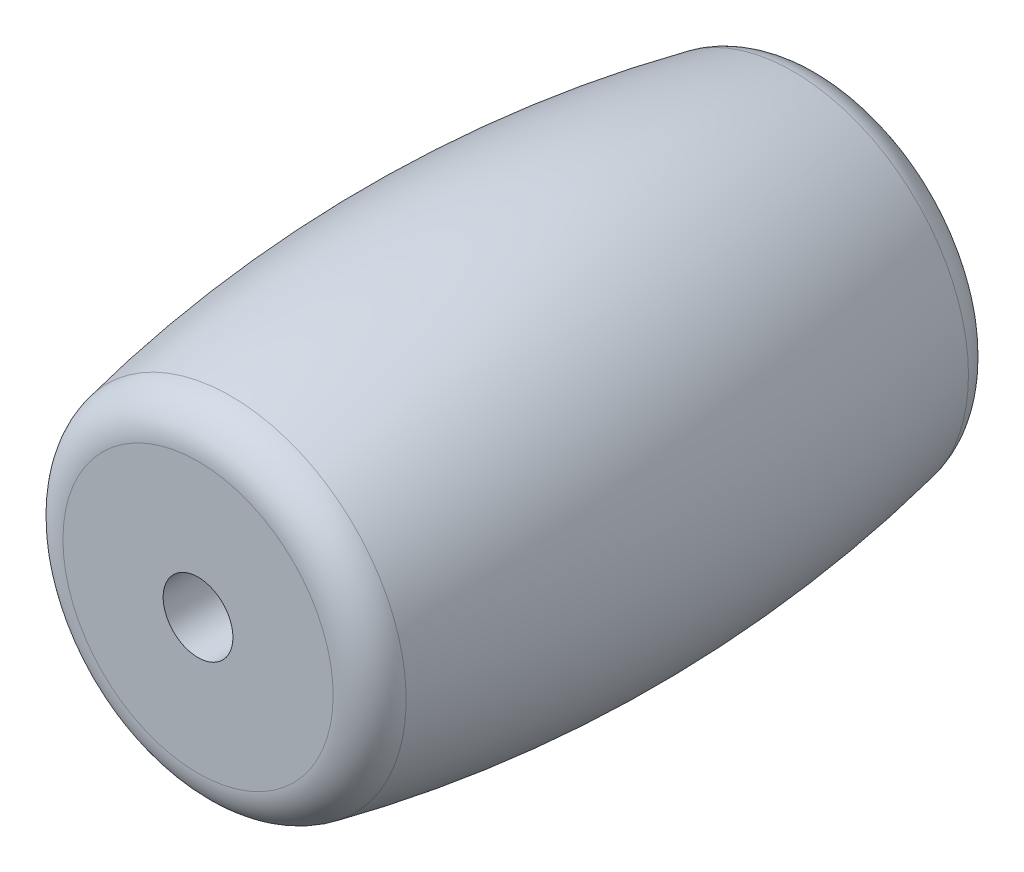
ISO-10303-21;
HEADER;
FILE_DESCRIPTION(('STEP AP214'),'2;1');
FILE_NAME('part.step','',(''),(''),'','','');
FILE_SCHEMA(('AUTOMOTIVE_DESIGN { 1 0 10303 214 1 1 1 1 }'));
ENDSEC;
DATA;
#1=APPLICATION_CONTEXT('core data for automotive mechanical design processes');
#2=APPLICATION_PROTOCOL_DEFINITION('international standard','automotive_design',2000,#1);
#3=PRODUCT_CONTEXT('',#1,'mechanical');
#4=PRODUCT('Part','Part','',(#3));
#5=PRODUCT_RELATED_PRODUCT_CATEGORY('part','',(#4));
#6=PRODUCT_DEFINITION_FORMATION('','',#4);
#7=PRODUCT_DEFINITION_CONTEXT('part definition',#1,'design');
#8=PRODUCT_DEFINITION('design','',#6,#7);
#9=PRODUCT_DEFINITION_SHAPE('','',#8);
#10=(LENGTH_UNIT() NAMED_UNIT(*) SI_UNIT(.MILLI.,.METRE.));
#11=(NAMED_UNIT(*) PLANE_ANGLE_UNIT() SI_UNIT($,.RADIAN.));
#12=(NAMED_UNIT(*) SI_UNIT($,.STERADIAN.) SOLID_ANGLE_UNIT());
#13=UNCERTAINTY_MEASURE_WITH_UNIT(LENGTH_MEASURE(1.E-05),#10,'distance_accuracy_value','');
#14=(GEOMETRIC_REPRESENTATION_CONTEXT(3) GLOBAL_UNCERTAINTY_ASSIGNED_CONTEXT((#13)) GLOBAL_UNIT_ASSIGNED_CONTEXT((#10,
#11,#12)) REPRESENTATION_CONTEXT('',''));
#15=CARTESIAN_POINT('',(0.,0.,0.));
#16=DIRECTION('',(0.,0.,1.));
#17=DIRECTION('',(1.,0.,0.));
#18=AXIS2_PLACEMENT_3D('',#15,#16,#17);
#19=CARTESIAN_POINT('',(0.,3.01016759554405,15.3));
#20=DIRECTION('',(0.,0.,-1.));
#21=DIRECTION('',(-1.,0.,0.));
#22=AXIS2_PLACEMENT_3D('',#19,#20,#21);
#23=PLANE('',#22);
#24=CARTESIAN_POINT('',(0.,1.31016759554405,15.3));
#25=DIRECTION('',(0.,0.,-1.));
#26=DIRECTION('',(-1.,0.,0.));
#27=AXIS2_PLACEMENT_3D('',#24,#25,#26);
#28=CIRCLE('',#27,6.58397541508283);
#29=CARTESIAN_POINT('',(-6.58397541508283,1.31016759554405,15.3));
#30=VERTEX_POINT('',#29);
#31=EDGE_CURVE('E10',#30,#30,#28,.F.);
#32=ORIENTED_EDGE('',*,*,#31,.T.);
#33=EDGE_LOOP('',(#32));
#34=FACE_BOUND('',#33,.T.);
#35=CARTESIAN_POINT('',(0.,1.31016759554405,15.3));
#36=DIRECTION('',(0.,0.,1.));
#37=DIRECTION('',(1.,0.,0.));
#38=AXIS2_PLACEMENT_3D('',#35,#36,#37);
#39=CIRCLE('',#38,1.7);
#40=CARTESIAN_POINT('',(1.7,1.31016759554405,15.3));
#41=VERTEX_POINT('',#40);
#42=EDGE_CURVE('E61',#41,#41,#39,.T.);
#43=ORIENTED_EDGE('',*,*,#42,.F.);
#44=EDGE_LOOP('',(#43));
#45=FACE_BOUND('',#44,.T.);
#46=ADVANCED_FACE('F37',(#34,#45),#23,.F.);
#47=CARTESIAN_POINT('',(0.,1.31016759554405,18.851269556302));
#48=DIRECTION('',(0.,0.,1.));
#49=DIRECTION('',(1.,0.,0.));
#50=AXIS2_PLACEMENT_3D('',#47,#48,#49);
#51=CYLINDRICAL_SURFACE('',#50,1.7);
#52=CARTESIAN_POINT('',(0.,1.31016759554405,-15.3));
#53=DIRECTION('',(0.,0.,1.));
#54=DIRECTION('',(1.,0.,0.));
#55=AXIS2_PLACEMENT_3D('',#52,#53,#54);
#56=CIRCLE('',#55,1.7);
#57=CARTESIAN_POINT('',(1.7,1.31016759554405,-15.3));
#58=VERTEX_POINT('',#57);
#59=EDGE_CURVE('E65',#58,#58,#56,.T.);
#60=ORIENTED_EDGE('',*,*,#59,.F.);
#61=EDGE_LOOP('',(#60));
#62=FACE_BOUND('',#61,.T.);
#63=ORIENTED_EDGE('',*,*,#42,.T.);
#64=EDGE_LOOP('',(#63));
#65=FACE_BOUND('',#64,.T.);
#66=ADVANCED_FACE('F72',(#62,#65),#51,.F.);
#67=CARTESIAN_POINT('',(0.,3.01016759554405,-15.3));
#68=DIRECTION('',(0.,0.,1.));
#69=DIRECTION('',(1.,0.,0.));
#70=AXIS2_PLACEMENT_3D('',#67,#68,#69);
#71=PLANE('',#70);
#72=CARTESIAN_POINT('',(0.,1.31016759554405,-15.3));
#73=DIRECTION('',(0.,0.,1.));
#74=DIRECTION('',(1.,0.,0.));
#75=AXIS2_PLACEMENT_3D('',#72,#73,#74);
#76=CIRCLE('',#75,6.58397541508283);
#77=CARTESIAN_POINT('',(6.58397541508283,1.31016759554405,-15.3));
#78=VERTEX_POINT('',#77);
#79=EDGE_CURVE('E45',#78,#78,#76,.F.);
#80=ORIENTED_EDGE('',*,*,#79,.T.);
#81=EDGE_LOOP('',(#80));
#82=FACE_BOUND('',#81,.T.);
#83=ORIENTED_EDGE('',*,*,#59,.T.);
#84=EDGE_LOOP('',(#83));
#85=FACE_BOUND('',#84,.T.);
#86=ADVANCED_FACE('F70',(#82,#85),#71,.F.);
#87=CARTESIAN_POINT('',(0.,1.31016759554405,0.));
#88=DIRECTION('',(0.,0.,1.));
#89=DIRECTION('',(1.,0.,0.));
#90=AXIS2_PLACEMENT_3D('',#87,#88,#89);
#91=DEGENERATE_TOROIDAL_SURFACE('',#90,58.0101675955441,67.9491721803793,.F.);
#92=CARTESIAN_POINT('',(0.,1.31016759554405,-13.7033409233287));
#93=DIRECTION('',(0.,0.,1.));
#94=DIRECTION('',(1.,0.,0.));
#95=AXIS2_PLACEMENT_3D('',#92,#93,#94);
#96=CIRCLE('',#95,8.5428822785065);
#97=CARTESIAN_POINT('',(8.5428822785065,1.31016759554405,-13.7033409233287));
#98=VERTEX_POINT('',#97);
#99=EDGE_CURVE('E50',#98,#98,#96,.T.);
#100=ORIENTED_EDGE('',*,*,#99,.T.);
#101=EDGE_LOOP('',(#100));
#102=FACE_BOUND('',#101,.T.);
#103=CARTESIAN_POINT('',(0.,1.31016759554405,13.7033409233287));
#104=DIRECTION('',(0.,0.,-1.));
#105=DIRECTION('',(-1.,0.,0.));
#106=AXIS2_PLACEMENT_3D('',#103,#104,#105);
#107=CIRCLE('',#106,8.5428822785065);
#108=CARTESIAN_POINT('',(-8.5428822785065,1.31016759554405,13.7033409233287));
#109=VERTEX_POINT('',#108);
#110=EDGE_CURVE('E55',#109,#109,#107,.T.);
#111=ORIENTED_EDGE('',*,*,#110,.T.);
#112=EDGE_LOOP('',(#111));
#113=FACE_BOUND('',#112,.T.);
#114=ADVANCED_FACE('F85',(#102,#113),#91,.F.);
#115=CARTESIAN_POINT('',(0.,1.31016759554405,-13.3));
#116=DIRECTION('',(0.,0.,1.));
#117=DIRECTION('',(1.,0.,0.));
#118=AXIS2_PLACEMENT_3D('',#115,#116,#117);
#119=TOROIDAL_SURFACE('',#118,6.58397541508283,2.);
#120=ORIENTED_EDGE('',*,*,#79,.F.);
#121=EDGE_LOOP('',(#120));
#122=FACE_BOUND('',#121,.T.);
#123=ORIENTED_EDGE('',*,*,#99,.F.);
#124=EDGE_LOOP('',(#123));
#125=FACE_BOUND('',#124,.T.);
#126=ADVANCED_FACE('F83',(#122,#125),#119,.T.);
#127=CARTESIAN_POINT('',(0.,1.31016759554405,13.3));
#128=DIRECTION('',(0.,0.,-1.));
#129=DIRECTION('',(-1.,0.,0.));
#130=AXIS2_PLACEMENT_3D('',#127,#128,#129);
#131=TOROIDAL_SURFACE('',#130,6.58397541508283,2.);
#132=ORIENTED_EDGE('',*,*,#110,.F.);
#133=EDGE_LOOP('',(#132));
#134=FACE_BOUND('',#133,.T.);
#135=ORIENTED_EDGE('',*,*,#31,.F.);
#136=EDGE_LOOP('',(#135));
#137=FACE_BOUND('',#136,.T.);
#138=ADVANCED_FACE('F39',(#134,#137),#131,.T.);
#139=CLOSED_SHELL('',(#46,#66,#86,#114,#126,#138));
#140=MANIFOLD_SOLID_BREP('B2',#139);
#141=ADVANCED_BREP_SHAPE_REPRESENTATION('',(#18,#140),#14);
#142=SHAPE_DEFINITION_REPRESENTATION(#9,#141);
ENDSEC;
END-ISO-10303-21;
